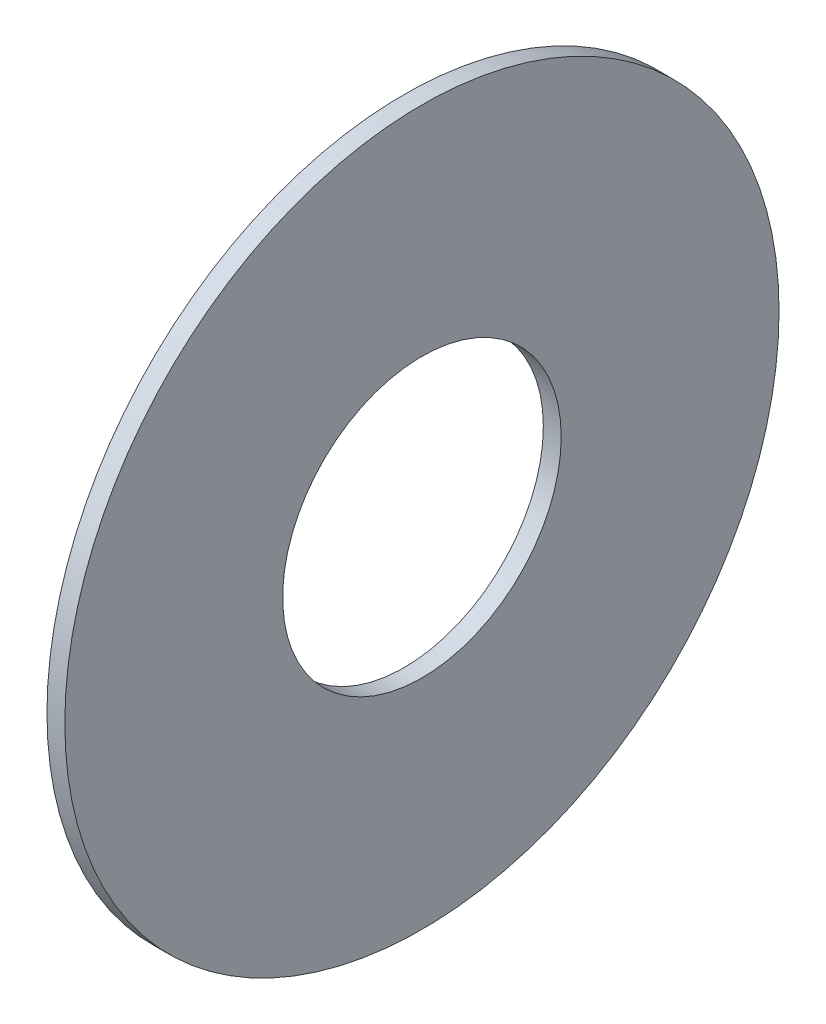
ISO-10303-21;
HEADER;
FILE_DESCRIPTION(('STEP AP214'),'2;1');
FILE_NAME('part.step','',(''),(''),'','','');
FILE_SCHEMA(('AUTOMOTIVE_DESIGN { 1 0 10303 214 1 1 1 1 }'));
ENDSEC;
DATA;
#1=APPLICATION_CONTEXT('core data for automotive mechanical design processes');
#2=APPLICATION_PROTOCOL_DEFINITION('international standard','automotive_design',2000,#1);
#3=PRODUCT_CONTEXT('',#1,'mechanical');
#4=PRODUCT('Part','Part','',(#3));
#5=PRODUCT_RELATED_PRODUCT_CATEGORY('part','',(#4));
#6=PRODUCT_DEFINITION_FORMATION('','',#4);
#7=PRODUCT_DEFINITION_CONTEXT('part definition',#1,'design');
#8=PRODUCT_DEFINITION('design','',#6,#7);
#9=PRODUCT_DEFINITION_SHAPE('','',#8);
#10=(LENGTH_UNIT() NAMED_UNIT(*) SI_UNIT(.MILLI.,.METRE.));
#11=(NAMED_UNIT(*) PLANE_ANGLE_UNIT() SI_UNIT($,.RADIAN.));
#12=(NAMED_UNIT(*) SI_UNIT($,.STERADIAN.) SOLID_ANGLE_UNIT());
#13=UNCERTAINTY_MEASURE_WITH_UNIT(LENGTH_MEASURE(1.E-05),#10,'distance_accuracy_value','');
#14=(GEOMETRIC_REPRESENTATION_CONTEXT(3) GLOBAL_UNCERTAINTY_ASSIGNED_CONTEXT((#13)) GLOBAL_UNIT_ASSIGNED_CONTEXT((#10,
#11,#12)) REPRESENTATION_CONTEXT('',''));
#15=CARTESIAN_POINT('',(0.,0.,0.));
#16=DIRECTION('',(0.,0.,1.));
#17=DIRECTION('',(1.,0.,0.));
#18=AXIS2_PLACEMENT_3D('',#15,#16,#17);
#19=CARTESIAN_POINT('',(3.175,0.,0.));
#20=DIRECTION('',(1.,0.,0.));
#21=DIRECTION('',(0.,0.,-1.));
#22=AXIS2_PLACEMENT_3D('',#19,#20,#21);
#23=PLANE('',#22);
#24=CARTESIAN_POINT('',(3.175,0.,0.));
#25=DIRECTION('',(1.,0.,0.));
#26=DIRECTION('',(0.,0.,-1.));
#27=AXIS2_PLACEMENT_3D('',#24,#25,#26);
#28=CIRCLE('',#27,63.5);
#29=CARTESIAN_POINT('',(3.175,0.,-63.5));
#30=VERTEX_POINT('',#29);
#31=EDGE_CURVE('E10',#30,#30,#28,.T.);
#32=ORIENTED_EDGE('',*,*,#31,.T.);
#33=EDGE_LOOP('',(#32));
#34=FACE_BOUND('',#33,.T.);
#35=CARTESIAN_POINT('',(3.175,0.,0.));
#36=DIRECTION('',(1.,0.,0.));
#37=DIRECTION('',(0.,0.,-1.));
#38=AXIS2_PLACEMENT_3D('',#35,#36,#37);
#39=CIRCLE('',#38,24.765);
#40=CARTESIAN_POINT('',(3.175,0.,-24.765));
#41=VERTEX_POINT('',#40);
#42=EDGE_CURVE('E45',#41,#41,#39,.T.);
#43=ORIENTED_EDGE('',*,*,#42,.F.);
#44=EDGE_LOOP('',(#43));
#45=FACE_BOUND('',#44,.T.);
#46=ADVANCED_FACE('F34',(#34,#45),#23,.T.);
#47=CARTESIAN_POINT('',(0.,0.,0.));
#48=DIRECTION('',(1.,0.,0.));
#49=DIRECTION('',(0.,0.,-1.));
#50=AXIS2_PLACEMENT_3D('',#47,#48,#49);
#51=PLANE('',#50);
#52=CARTESIAN_POINT('',(0.,0.,0.));
#53=DIRECTION('',(1.,0.,0.));
#54=DIRECTION('',(0.,0.,-1.));
#55=AXIS2_PLACEMENT_3D('',#52,#53,#54);
#56=CIRCLE('',#55,63.5);
#57=CARTESIAN_POINT('',(0.,0.,-63.5));
#58=VERTEX_POINT('',#57);
#59=EDGE_CURVE('E38',#58,#58,#56,.T.);
#60=ORIENTED_EDGE('',*,*,#59,.F.);
#61=EDGE_LOOP('',(#60));
#62=FACE_BOUND('',#61,.T.);
#63=CARTESIAN_POINT('',(0.,0.,0.));
#64=DIRECTION('',(1.,0.,0.));
#65=DIRECTION('',(0.,0.,-1.));
#66=AXIS2_PLACEMENT_3D('',#63,#64,#65);
#67=CIRCLE('',#66,24.765);
#68=CARTESIAN_POINT('',(0.,0.,-24.765));
#69=VERTEX_POINT('',#68);
#70=EDGE_CURVE('E47',#69,#69,#67,.T.);
#71=ORIENTED_EDGE('',*,*,#70,.T.);
#72=EDGE_LOOP('',(#71));
#73=FACE_BOUND('',#72,.T.);
#74=ADVANCED_FACE('F57',(#62,#73),#51,.F.);
#75=CARTESIAN_POINT('',(3.175,0.,0.));
#76=DIRECTION('',(-1.,0.,0.));
#77=DIRECTION('',(0.,0.,1.));
#78=AXIS2_PLACEMENT_3D('',#75,#76,#77);
#79=CYLINDRICAL_SURFACE('',#78,63.5);
#80=ORIENTED_EDGE('',*,*,#31,.F.);
#81=EDGE_LOOP('',(#80));
#82=FACE_BOUND('',#81,.T.);
#83=ORIENTED_EDGE('',*,*,#59,.T.);
#84=EDGE_LOOP('',(#83));
#85=FACE_BOUND('',#84,.T.);
#86=ADVANCED_FACE('F36',(#82,#85),#79,.T.);
#87=CARTESIAN_POINT('',(3.175,0.,0.));
#88=DIRECTION('',(-1.,0.,0.));
#89=DIRECTION('',(0.,0.,1.));
#90=AXIS2_PLACEMENT_3D('',#87,#88,#89);
#91=CYLINDRICAL_SURFACE('',#90,24.765);
#92=ORIENTED_EDGE('',*,*,#42,.T.);
#93=EDGE_LOOP('',(#92));
#94=FACE_BOUND('',#93,.T.);
#95=ORIENTED_EDGE('',*,*,#70,.F.);
#96=EDGE_LOOP('',(#95));
#97=FACE_BOUND('',#96,.T.);
#98=ADVANCED_FACE('F53',(#94,#97),#91,.F.);
#99=CLOSED_SHELL('',(#46,#74,#86,#98));
#100=MANIFOLD_SOLID_BREP('B2',#99);
#101=ADVANCED_BREP_SHAPE_REPRESENTATION('',(#18,#100),#14);
#102=SHAPE_DEFINITION_REPRESENTATION(#9,#101);
ENDSEC;
END-ISO-10303-21;
